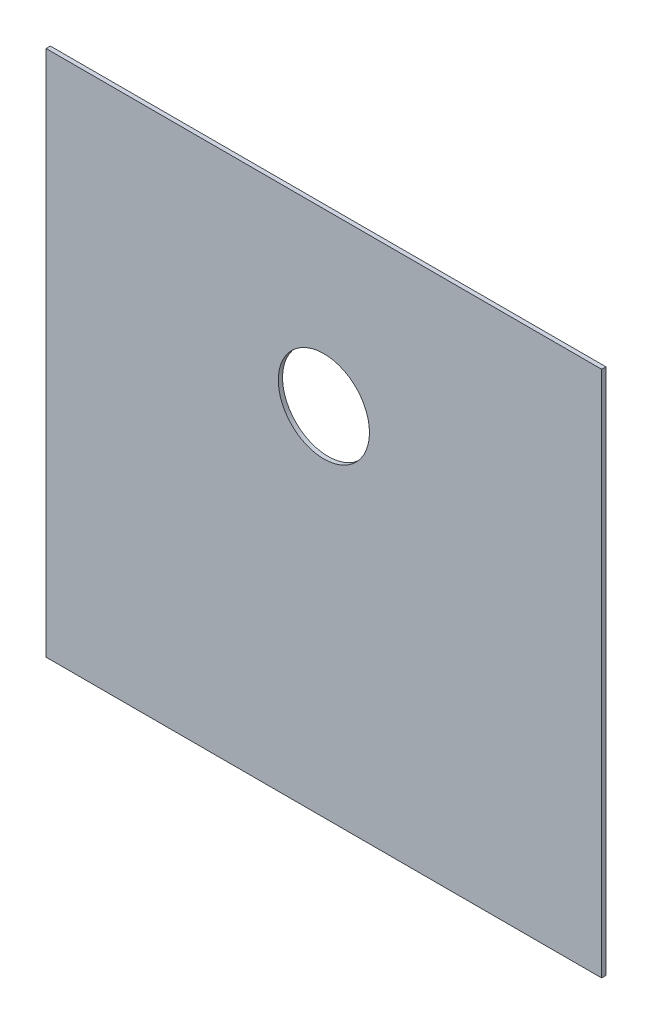
ISO-10303-21;
HEADER;
FILE_DESCRIPTION(('STEP AP214'),'2;1');
FILE_NAME('part.step','',(''),(''),'','','');
FILE_SCHEMA(('AUTOMOTIVE_DESIGN { 1 0 10303 214 1 1 1 1 }'));
ENDSEC;
DATA;
#1=APPLICATION_CONTEXT('core data for automotive mechanical design processes');
#2=APPLICATION_PROTOCOL_DEFINITION('international standard','automotive_design',2000,#1);
#3=PRODUCT_CONTEXT('',#1,'mechanical');
#4=PRODUCT('Part','Part','',(#3));
#5=PRODUCT_RELATED_PRODUCT_CATEGORY('part','',(#4));
#6=PRODUCT_DEFINITION_FORMATION('','',#4);
#7=PRODUCT_DEFINITION_CONTEXT('part definition',#1,'design');
#8=PRODUCT_DEFINITION('design','',#6,#7);
#9=PRODUCT_DEFINITION_SHAPE('','',#8);
#10=(LENGTH_UNIT() NAMED_UNIT(*) SI_UNIT(.MILLI.,.METRE.));
#11=(NAMED_UNIT(*) PLANE_ANGLE_UNIT() SI_UNIT($,.RADIAN.));
#12=(NAMED_UNIT(*) SI_UNIT($,.STERADIAN.) SOLID_ANGLE_UNIT());
#13=UNCERTAINTY_MEASURE_WITH_UNIT(LENGTH_MEASURE(1.E-05),#10,'distance_accuracy_value','');
#14=(GEOMETRIC_REPRESENTATION_CONTEXT(3) GLOBAL_UNCERTAINTY_ASSIGNED_CONTEXT((#13)) GLOBAL_UNIT_ASSIGNED_CONTEXT((#10,
#11,#12)) REPRESENTATION_CONTEXT('',''));
#15=CARTESIAN_POINT('',(0.,0.,0.));
#16=DIRECTION('',(0.,0.,1.));
#17=DIRECTION('',(1.,0.,0.));
#18=AXIS2_PLACEMENT_3D('',#15,#16,#17);
#19=CARTESIAN_POINT('',(-195.,-185.,3.));
#20=DIRECTION('',(1.,0.,0.));
#21=DIRECTION('',(0.,0.,-1.));
#22=AXIS2_PLACEMENT_3D('',#19,#20,#21);
#23=PLANE('',#22);
#24=DIRECTION('',(0.,-1.,0.));
#25=VECTOR('',#24,1.);
#26=CARTESIAN_POINT('',(-195.,-185.,0.));
#27=LINE('',#26,#25);
#28=CARTESIAN_POINT('',(-195.,185.,0.));
#29=VERTEX_POINT('',#28);
#30=CARTESIAN_POINT('',(-195.,-185.,0.));
#31=VERTEX_POINT('',#30);
#32=EDGE_CURVE('E96',#29,#31,#27,.T.);
#33=ORIENTED_EDGE('',*,*,#32,.T.);
#34=DIRECTION('',(0.,0.,-1.));
#35=VECTOR('',#34,1.);
#36=CARTESIAN_POINT('',(-195.,-185.,3.));
#37=LINE('',#36,#35);
#38=CARTESIAN_POINT('',(-195.,-185.,3.));
#39=VERTEX_POINT('',#38);
#40=EDGE_CURVE('E11',#39,#31,#37,.T.);
#41=ORIENTED_EDGE('',*,*,#40,.F.);
#42=DIRECTION('',(0.,-1.,0.));
#43=VECTOR('',#42,1.);
#44=CARTESIAN_POINT('',(-195.,-185.,3.));
#45=LINE('',#44,#43);
#46=CARTESIAN_POINT('',(-195.,185.,3.));
#47=VERTEX_POINT('',#46);
#48=EDGE_CURVE('E84',#47,#39,#45,.T.);
#49=ORIENTED_EDGE('',*,*,#48,.F.);
#50=DIRECTION('',(0.,0.,-1.));
#51=VECTOR('',#50,1.);
#52=CARTESIAN_POINT('',(-195.,185.,3.));
#53=LINE('',#52,#51);
#54=EDGE_CURVE('E92',#47,#29,#53,.T.);
#55=ORIENTED_EDGE('',*,*,#54,.T.);
#56=EDGE_LOOP('',(#33,#41,#49,#55));
#57=FACE_BOUND('',#56,.T.);
#58=ADVANCED_FACE('F33',(#57),#23,.F.);
#59=CARTESIAN_POINT('',(195.,-185.,3.));
#60=DIRECTION('',(0.,1.,0.));
#61=DIRECTION('',(-1.,0.,0.));
#62=AXIS2_PLACEMENT_3D('',#59,#60,#61);
#63=PLANE('',#62);
#64=DIRECTION('',(1.,0.,0.));
#65=VECTOR('',#64,1.);
#66=CARTESIAN_POINT('',(195.,-185.,0.));
#67=LINE('',#66,#65);
#68=CARTESIAN_POINT('',(195.,-185.,0.));
#69=VERTEX_POINT('',#68);
#70=EDGE_CURVE('E88',#31,#69,#67,.T.);
#71=ORIENTED_EDGE('',*,*,#70,.T.);
#72=DIRECTION('',(0.,0.,-1.));
#73=VECTOR('',#72,1.);
#74=CARTESIAN_POINT('',(195.,-185.,3.));
#75=LINE('',#74,#73);
#76=CARTESIAN_POINT('',(195.,-185.,3.));
#77=VERTEX_POINT('',#76);
#78=EDGE_CURVE('E41',#77,#69,#75,.T.);
#79=ORIENTED_EDGE('',*,*,#78,.F.);
#80=DIRECTION('',(1.,0.,0.));
#81=VECTOR('',#80,1.);
#82=CARTESIAN_POINT('',(195.,-185.,3.));
#83=LINE('',#82,#81);
#84=EDGE_CURVE('E79',#39,#77,#83,.T.);
#85=ORIENTED_EDGE('',*,*,#84,.F.);
#86=ORIENTED_EDGE('',*,*,#40,.T.);
#87=EDGE_LOOP('',(#71,#79,#85,#86));
#88=FACE_BOUND('',#87,.T.);
#89=ADVANCED_FACE('F87',(#88),#63,.F.);
#90=CARTESIAN_POINT('',(195.,-185.,3.));
#91=DIRECTION('',(-1.,0.,0.));
#92=DIRECTION('',(0.,0.,1.));
#93=AXIS2_PLACEMENT_3D('',#90,#91,#92);
#94=PLANE('',#93);
#95=DIRECTION('',(0.,1.,0.));
#96=VECTOR('',#95,1.);
#97=CARTESIAN_POINT('',(195.,-185.,0.));
#98=LINE('',#97,#96);
#99=CARTESIAN_POINT('',(195.,185.,0.));
#100=VERTEX_POINT('',#99);
#101=EDGE_CURVE('E66',#69,#100,#98,.T.);
#102=ORIENTED_EDGE('',*,*,#101,.T.);
#103=DIRECTION('',(0.,0.,-1.));
#104=VECTOR('',#103,1.);
#105=CARTESIAN_POINT('',(195.,185.,3.));
#106=LINE('',#105,#104);
#107=CARTESIAN_POINT('',(195.,185.,3.));
#108=VERTEX_POINT('',#107);
#109=EDGE_CURVE('E89',#108,#100,#106,.T.);
#110=ORIENTED_EDGE('',*,*,#109,.F.);
#111=DIRECTION('',(0.,1.,0.));
#112=VECTOR('',#111,1.);
#113=CARTESIAN_POINT('',(195.,-185.,3.));
#114=LINE('',#113,#112);
#115=EDGE_CURVE('E82',#77,#108,#114,.T.);
#116=ORIENTED_EDGE('',*,*,#115,.F.);
#117=ORIENTED_EDGE('',*,*,#78,.T.);
#118=EDGE_LOOP('',(#102,#110,#116,#117));
#119=FACE_BOUND('',#118,.T.);
#120=ADVANCED_FACE('F90',(#119),#94,.F.);
#121=CARTESIAN_POINT('',(195.,185.,3.));
#122=DIRECTION('',(0.,-1.,0.));
#123=DIRECTION('',(1.,0.,0.));
#124=AXIS2_PLACEMENT_3D('',#121,#122,#123);
#125=PLANE('',#124);
#126=DIRECTION('',(-1.,0.,0.));
#127=VECTOR('',#126,1.);
#128=CARTESIAN_POINT('',(195.,185.,0.));
#129=LINE('',#128,#127);
#130=EDGE_CURVE('E72',#100,#29,#129,.T.);
#131=ORIENTED_EDGE('',*,*,#130,.T.);
#132=ORIENTED_EDGE('',*,*,#54,.F.);
#133=DIRECTION('',(-1.,0.,0.));
#134=VECTOR('',#133,1.);
#135=CARTESIAN_POINT('',(195.,185.,3.));
#136=LINE('',#135,#134);
#137=EDGE_CURVE('E49',#108,#47,#136,.T.);
#138=ORIENTED_EDGE('',*,*,#137,.F.);
#139=ORIENTED_EDGE('',*,*,#109,.T.);
#140=EDGE_LOOP('',(#131,#132,#138,#139));
#141=FACE_BOUND('',#140,.T.);
#142=ADVANCED_FACE('F104',(#141),#125,.F.);
#143=CARTESIAN_POINT('',(0.,0.,3.));
#144=DIRECTION('',(0.,0.,1.));
#145=DIRECTION('',(1.,0.,0.));
#146=AXIS2_PLACEMENT_3D('',#143,#144,#145);
#147=PLANE('',#146);
#148=CARTESIAN_POINT('',(0.,65.,3.));
#149=DIRECTION('',(0.,0.,1.));
#150=DIRECTION('',(1.,0.,0.));
#151=AXIS2_PLACEMENT_3D('',#148,#149,#150);
#152=CIRCLE('',#151,32.);
#153=CARTESIAN_POINT('',(32.,65.,3.));
#154=VERTEX_POINT('',#153);
#155=EDGE_CURVE('E110',#154,#154,#152,.T.);
#156=ORIENTED_EDGE('',*,*,#155,.F.);
#157=EDGE_LOOP('',(#156));
#158=FACE_BOUND('',#157,.T.);
#159=ORIENTED_EDGE('',*,*,#48,.T.);
#160=ORIENTED_EDGE('',*,*,#84,.T.);
#161=ORIENTED_EDGE('',*,*,#115,.T.);
#162=ORIENTED_EDGE('',*,*,#137,.T.);
#163=EDGE_LOOP('',(#159,#160,#161,#162));
#164=FACE_BOUND('',#163,.T.);
#165=ADVANCED_FACE('F80',(#158,#164),#147,.T.);
#166=CARTESIAN_POINT('',(0.,0.,0.));
#167=DIRECTION('',(0.,0.,1.));
#168=DIRECTION('',(1.,0.,0.));
#169=AXIS2_PLACEMENT_3D('',#166,#167,#168);
#170=PLANE('',#169);
#171=CARTESIAN_POINT('',(0.,65.,0.));
#172=DIRECTION('',(0.,0.,1.));
#173=DIRECTION('',(1.,0.,0.));
#174=AXIS2_PLACEMENT_3D('',#171,#172,#173);
#175=CIRCLE('',#174,32.);
#176=CARTESIAN_POINT('',(32.,65.,0.));
#177=VERTEX_POINT('',#176);
#178=EDGE_CURVE('E99',#177,#177,#175,.T.);
#179=ORIENTED_EDGE('',*,*,#178,.T.);
#180=EDGE_LOOP('',(#179));
#181=FACE_BOUND('',#180,.T.);
#182=ORIENTED_EDGE('',*,*,#32,.F.);
#183=ORIENTED_EDGE('',*,*,#130,.F.);
#184=ORIENTED_EDGE('',*,*,#101,.F.);
#185=ORIENTED_EDGE('',*,*,#70,.F.);
#186=EDGE_LOOP('',(#182,#183,#184,#185));
#187=FACE_BOUND('',#186,.T.);
#188=ADVANCED_FACE('F107',(#181,#187),#170,.F.);
#189=CARTESIAN_POINT('',(0.,65.,0.));
#190=DIRECTION('',(0.,0.,1.));
#191=DIRECTION('',(1.,0.,0.));
#192=AXIS2_PLACEMENT_3D('',#189,#190,#191);
#193=CYLINDRICAL_SURFACE('',#192,32.);
#194=ORIENTED_EDGE('',*,*,#178,.F.);
#195=EDGE_LOOP('',(#194));
#196=FACE_BOUND('',#195,.T.);
#197=ORIENTED_EDGE('',*,*,#155,.T.);
#198=EDGE_LOOP('',(#197));
#199=FACE_BOUND('',#198,.T.);
#200=ADVANCED_FACE('F117',(#196,#199),#193,.F.);
#201=CLOSED_SHELL('',(#58,#89,#120,#142,#165,#188,#200));
#202=MANIFOLD_SOLID_BREP('B2',#201);
#203=ADVANCED_BREP_SHAPE_REPRESENTATION('',(#18,#202),#14);
#204=SHAPE_DEFINITION_REPRESENTATION(#9,#203);
ENDSEC;
END-ISO-10303-21;
